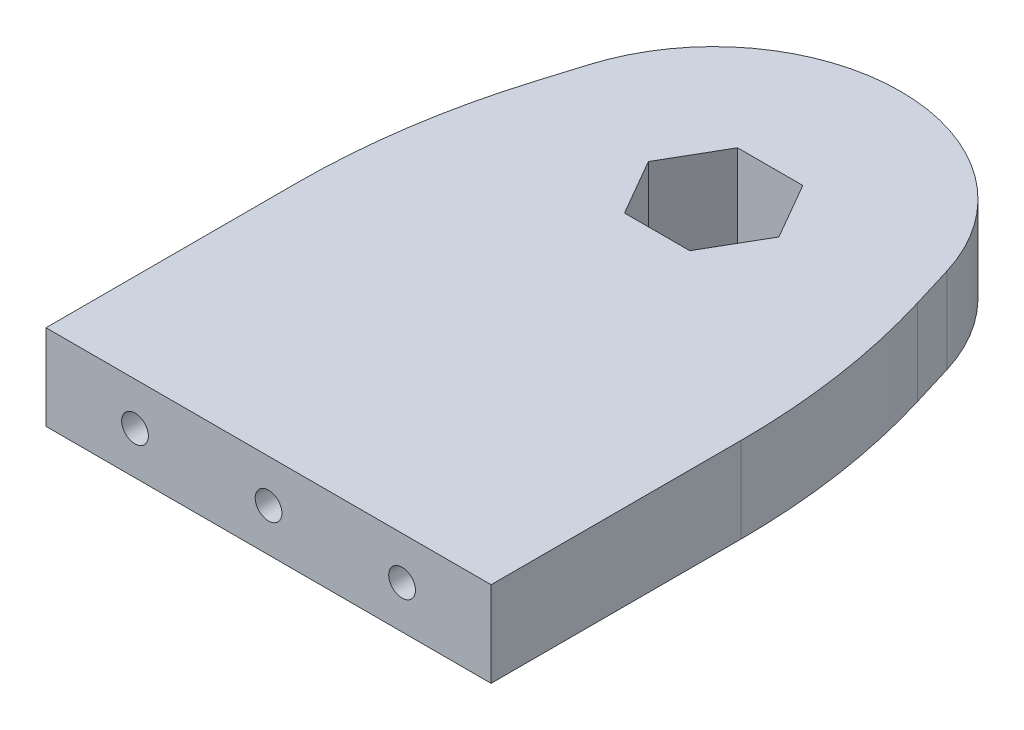
ISO-10303-21;
HEADER;
FILE_DESCRIPTION(('STEP AP214'),'2;1');
FILE_NAME('part.step','',(''),(''),'','','');
FILE_SCHEMA(('AUTOMOTIVE_DESIGN { 1 0 10303 214 1 1 1 1 }'));
ENDSEC;
DATA;
#1=APPLICATION_CONTEXT('core data for automotive mechanical design processes');
#2=APPLICATION_PROTOCOL_DEFINITION('international standard','automotive_design',2000,#1);
#3=PRODUCT_CONTEXT('',#1,'mechanical');
#4=PRODUCT('Part','Part','',(#3));
#5=PRODUCT_RELATED_PRODUCT_CATEGORY('part','',(#4));
#6=PRODUCT_DEFINITION_FORMATION('','',#4);
#7=PRODUCT_DEFINITION_CONTEXT('part definition',#1,'design');
#8=PRODUCT_DEFINITION('design','',#6,#7);
#9=PRODUCT_DEFINITION_SHAPE('','',#8);
#10=(LENGTH_UNIT() NAMED_UNIT(*) SI_UNIT(.MILLI.,.METRE.));
#11=(NAMED_UNIT(*) PLANE_ANGLE_UNIT() SI_UNIT($,.RADIAN.));
#12=(NAMED_UNIT(*) SI_UNIT($,.STERADIAN.) SOLID_ANGLE_UNIT());
#13=UNCERTAINTY_MEASURE_WITH_UNIT(LENGTH_MEASURE(1.E-05),#10,'distance_accuracy_value','');
#14=(GEOMETRIC_REPRESENTATION_CONTEXT(3) GLOBAL_UNCERTAINTY_ASSIGNED_CONTEXT((#13)) GLOBAL_UNIT_ASSIGNED_CONTEXT((#10,
#11,#12)) REPRESENTATION_CONTEXT('',''));
#15=CARTESIAN_POINT('',(0.,0.,0.));
#16=DIRECTION('',(0.,0.,1.));
#17=DIRECTION('',(1.,0.,0.));
#18=AXIS2_PLACEMENT_3D('',#15,#16,#17);
#19=CARTESIAN_POINT('',(28.4523865510361,9.6,-8.66907425965164));
#20=DIRECTION('',(-0.956583442018658,0.,0.291458605046645));
#21=DIRECTION('',(0.291458605046645,0.,0.956583442018658));
#22=AXIS2_PLACEMENT_3D('',#19,#20,#21);
#23=PLANE('',#22);
#24=DIRECTION('',(-0.291458605046645,0.,-0.956583442018658));
#25=VECTOR('',#24,1.);
#26=CARTESIAN_POINT('',(28.4523865510361,9.6,-8.66907425965164));
#27=LINE('',#26,#25);
#28=CARTESIAN_POINT('',(21.5266753614927,9.6,-31.3996457144226));
#29=VERTEX_POINT('',#28);
#30=CARTESIAN_POINT('',(20.0882522823918,9.6,-36.1206307059796));
#31=VERTEX_POINT('',#30);
#32=EDGE_CURVE('E202',#29,#31,#27,.T.);
#33=ORIENTED_EDGE('',*,*,#32,.F.);
#34=DIRECTION('',(0.,-1.,0.));
#35=VECTOR('',#34,1.);
#36=CARTESIAN_POINT('',(21.5266753614927,0.,-31.3996457144226));
#37=LINE('',#36,#35);
#38=CARTESIAN_POINT('',(21.5266753614927,0.,-31.3996457144226));
#39=VERTEX_POINT('',#38);
#40=EDGE_CURVE('E241',#29,#39,#37,.T.);
#41=ORIENTED_EDGE('',*,*,#40,.T.);
#42=DIRECTION('',(-0.291458605046645,0.,-0.956583442018658));
#43=VECTOR('',#42,1.);
#44=CARTESIAN_POINT('',(28.4523865510361,0.,-8.66907425965164));
#45=LINE('',#44,#43);
#46=CARTESIAN_POINT('',(20.0882522823918,0.,-36.1206307059796));
#47=VERTEX_POINT('',#46);
#48=EDGE_CURVE('E199',#39,#47,#45,.T.);
#49=ORIENTED_EDGE('',*,*,#48,.T.);
#50=DIRECTION('',(0.,-1.,0.));
#51=VECTOR('',#50,1.);
#52=CARTESIAN_POINT('',(20.0882522823918,9.6,-36.1206307059796));
#53=LINE('',#52,#51);
#54=EDGE_CURVE('E238',#31,#47,#53,.T.);
#55=ORIENTED_EDGE('',*,*,#54,.F.);
#56=EDGE_LOOP('',(#33,#41,#49,#55));
#57=FACE_BOUND('',#56,.T.);
#58=ADVANCED_FACE('F43',(#57),#23,.F.);
#59=CARTESIAN_POINT('',(0.,9.6,-30.));
#60=DIRECTION('',(0.,-1.,0.));
#61=DIRECTION('',(0.,0.,-1.));
#62=AXIS2_PLACEMENT_3D('',#59,#60,#61);
#63=CYLINDRICAL_SURFACE('',#62,21.);
#64=CARTESIAN_POINT('',(0.,0.,-30.));
#65=DIRECTION('',(0.,1.,0.));
#66=DIRECTION('',(0.,0.,1.));
#67=AXIS2_PLACEMENT_3D('',#64,#65,#66);
#68=CIRCLE('',#67,21.);
#69=CARTESIAN_POINT('',(-20.0882522823918,0.,-36.1206307059796));
#70=VERTEX_POINT('',#69);
#71=EDGE_CURVE('E219',#47,#70,#68,.T.);
#72=ORIENTED_EDGE('',*,*,#71,.T.);
#73=DIRECTION('',(0.,-1.,0.));
#74=VECTOR('',#73,1.);
#75=CARTESIAN_POINT('',(-20.0882522823918,9.6,-36.1206307059796));
#76=LINE('',#75,#74);
#77=CARTESIAN_POINT('',(-20.0882522823918,9.6,-36.1206307059796));
#78=VERTEX_POINT('',#77);
#79=EDGE_CURVE('E235',#78,#70,#76,.T.);
#80=ORIENTED_EDGE('',*,*,#79,.F.);
#81=CARTESIAN_POINT('',(0.,9.6,-30.));
#82=DIRECTION('',(0.,1.,0.));
#83=DIRECTION('',(0.,0.,1.));
#84=AXIS2_PLACEMENT_3D('',#81,#82,#83);
#85=CIRCLE('',#84,21.);
#86=EDGE_CURVE('E204',#31,#78,#85,.T.);
#87=ORIENTED_EDGE('',*,*,#86,.F.);
#88=ORIENTED_EDGE('',*,*,#54,.T.);
#89=EDGE_LOOP('',(#72,#80,#87,#88));
#90=FACE_BOUND('',#89,.T.);
#91=ADVANCED_FACE('F295',(#90),#63,.T.);
#92=CARTESIAN_POINT('',(-28.4523865510361,9.6,-8.66907425965166));
#93=DIRECTION('',(-0.956583442018658,0.,-0.291458605046646));
#94=DIRECTION('',(-0.291458605046646,0.,0.956583442018658));
#95=AXIS2_PLACEMENT_3D('',#92,#93,#94);
#96=PLANE('',#95);
#97=DIRECTION('',(0.291458605046646,0.,-0.956583442018658));
#98=VECTOR('',#97,1.);
#99=CARTESIAN_POINT('',(-28.4523865510361,0.,-8.66907425965166));
#100=LINE('',#99,#98);
#101=CARTESIAN_POINT('',(-21.5266753614926,0.,-31.3996457144226));
#102=VERTEX_POINT('',#101);
#103=EDGE_CURVE('E222',#102,#70,#100,.T.);
#104=ORIENTED_EDGE('',*,*,#103,.F.);
#105=DIRECTION('',(0.,-1.,0.));
#106=VECTOR('',#105,1.);
#107=CARTESIAN_POINT('',(-21.5266753614926,9.6,-31.3996457144226));
#108=LINE('',#107,#106);
#109=CARTESIAN_POINT('',(-21.5266753614926,9.6,-31.3996457144226));
#110=VERTEX_POINT('',#109);
#111=EDGE_CURVE('E257',#102,#110,#108,.F.);
#112=ORIENTED_EDGE('',*,*,#111,.T.);
#113=DIRECTION('',(0.291458605046646,0.,-0.956583442018658));
#114=VECTOR('',#113,1.);
#115=CARTESIAN_POINT('',(-28.4523865510361,9.6,-8.66907425965166));
#116=LINE('',#115,#114);
#117=EDGE_CURVE('E208',#110,#78,#116,.T.);
#118=ORIENTED_EDGE('',*,*,#117,.T.);
#119=ORIENTED_EDGE('',*,*,#79,.T.);
#120=EDGE_LOOP('',(#104,#112,#118,#119));
#121=FACE_BOUND('',#120,.T.);
#122=ADVANCED_FACE('F301',(#121),#96,.T.);
#123=CARTESIAN_POINT('',(-25.,9.6,0.));
#124=DIRECTION('',(1.,0.,0.));
#125=DIRECTION('',(0.,0.,-1.));
#126=AXIS2_PLACEMENT_3D('',#123,#124,#125);
#127=PLANE('',#126);
#128=DIRECTION('',(0.,0.,1.));
#129=VECTOR('',#128,1.);
#130=CARTESIAN_POINT('',(-25.,9.6,0.));
#131=LINE('',#130,#129);
#132=CARTESIAN_POINT('',(-25.,9.6,-8.08295731069094));
#133=VERTEX_POINT('',#132);
#134=CARTESIAN_POINT('',(-25.,9.6,20.));
#135=VERTEX_POINT('',#134);
#136=EDGE_CURVE('E210',#133,#135,#131,.T.);
#137=ORIENTED_EDGE('',*,*,#136,.F.);
#138=DIRECTION('',(0.,-1.,0.));
#139=VECTOR('',#138,1.);
#140=CARTESIAN_POINT('',(-25.,0.,-8.08295731069094));
#141=LINE('',#140,#139);
#142=CARTESIAN_POINT('',(-25.,0.,-8.08295731069094));
#143=VERTEX_POINT('',#142);
#144=EDGE_CURVE('E254',#133,#143,#141,.T.);
#145=ORIENTED_EDGE('',*,*,#144,.T.);
#146=DIRECTION('',(0.,0.,1.));
#147=VECTOR('',#146,1.);
#148=CARTESIAN_POINT('',(-25.,0.,0.));
#149=LINE('',#148,#147);
#150=CARTESIAN_POINT('',(-25.,0.,20.));
#151=VERTEX_POINT('',#150);
#152=EDGE_CURVE('E224',#143,#151,#149,.T.);
#153=ORIENTED_EDGE('',*,*,#152,.T.);
#154=DIRECTION('',(0.,-1.,0.));
#155=VECTOR('',#154,1.);
#156=CARTESIAN_POINT('',(-25.,9.6,20.));
#157=LINE('',#156,#155);
#158=EDGE_CURVE('E232',#135,#151,#157,.T.);
#159=ORIENTED_EDGE('',*,*,#158,.F.);
#160=EDGE_LOOP('',(#137,#145,#153,#159));
#161=FACE_BOUND('',#160,.T.);
#162=ADVANCED_FACE('F333',(#161),#127,.F.);
#163=CARTESIAN_POINT('',(0.,9.6,20.));
#164=DIRECTION('',(0.,0.,-1.));
#165=DIRECTION('',(-1.,0.,0.));
#166=AXIS2_PLACEMENT_3D('',#163,#164,#165);
#167=PLANE('',#166);
#168=CARTESIAN_POINT('',(15.,4.8,20.));
#169=DIRECTION('',(0.,0.,1.));
#170=DIRECTION('',(1.,0.,0.));
#171=AXIS2_PLACEMENT_3D('',#168,#169,#170);
#172=CIRCLE('',#171,1.5);
#173=CARTESIAN_POINT('',(16.5,4.8,20.));
#174=VERTEX_POINT('',#173);
#175=EDGE_CURVE('E184',#174,#174,#172,.T.);
#176=ORIENTED_EDGE('',*,*,#175,.F.);
#177=EDGE_LOOP('',(#176));
#178=FACE_BOUND('',#177,.T.);
#179=CARTESIAN_POINT('',(-15.,4.8,20.));
#180=DIRECTION('',(0.,0.,1.));
#181=DIRECTION('',(1.,0.,0.));
#182=AXIS2_PLACEMENT_3D('',#179,#180,#181);
#183=CIRCLE('',#182,1.5);
#184=CARTESIAN_POINT('',(-13.5,4.8,20.));
#185=VERTEX_POINT('',#184);
#186=EDGE_CURVE('E177',#185,#185,#183,.T.);
#187=ORIENTED_EDGE('',*,*,#186,.F.);
#188=EDGE_LOOP('',(#187));
#189=FACE_BOUND('',#188,.T.);
#190=CARTESIAN_POINT('',(0.,4.8,20.));
#191=DIRECTION('',(0.,0.,1.));
#192=DIRECTION('',(1.,0.,0.));
#193=AXIS2_PLACEMENT_3D('',#190,#191,#192);
#194=CIRCLE('',#193,1.5);
#195=CARTESIAN_POINT('',(1.5,4.8,20.));
#196=VERTEX_POINT('',#195);
#197=EDGE_CURVE('E191',#196,#196,#194,.T.);
#198=ORIENTED_EDGE('',*,*,#197,.F.);
#199=EDGE_LOOP('',(#198));
#200=FACE_BOUND('',#199,.T.);
#201=DIRECTION('',(1.,0.,0.));
#202=VECTOR('',#201,1.);
#203=CARTESIAN_POINT('',(0.,0.,20.));
#204=LINE('',#203,#202);
#205=CARTESIAN_POINT('',(25.,0.,20.));
#206=VERTEX_POINT('',#205);
#207=EDGE_CURVE('E226',#151,#206,#204,.T.);
#208=ORIENTED_EDGE('',*,*,#207,.T.);
#209=DIRECTION('',(0.,-1.,0.));
#210=VECTOR('',#209,1.);
#211=CARTESIAN_POINT('',(25.,9.6,20.));
#212=LINE('',#211,#210);
#213=CARTESIAN_POINT('',(25.,9.6,20.));
#214=VERTEX_POINT('',#213);
#215=EDGE_CURVE('E217',#214,#206,#212,.T.);
#216=ORIENTED_EDGE('',*,*,#215,.F.);
#217=DIRECTION('',(1.,0.,0.));
#218=VECTOR('',#217,1.);
#219=CARTESIAN_POINT('',(0.,9.6,20.));
#220=LINE('',#219,#218);
#221=EDGE_CURVE('E212',#135,#214,#220,.T.);
#222=ORIENTED_EDGE('',*,*,#221,.F.);
#223=ORIENTED_EDGE('',*,*,#158,.T.);
#224=EDGE_LOOP('',(#208,#216,#222,#223));
#225=FACE_BOUND('',#224,.T.);
#226=ADVANCED_FACE('F340',(#178,#189,#200,#225),#167,.F.);
#227=CARTESIAN_POINT('',(25.,9.6,0.));
#228=DIRECTION('',(1.,0.,0.));
#229=DIRECTION('',(0.,0.,-1.));
#230=AXIS2_PLACEMENT_3D('',#227,#228,#229);
#231=PLANE('',#230);
#232=DIRECTION('',(0.,0.,1.));
#233=VECTOR('',#232,1.);
#234=CARTESIAN_POINT('',(25.,0.,0.));
#235=LINE('',#234,#233);
#236=CARTESIAN_POINT('',(25.,0.,-8.08295731069096));
#237=VERTEX_POINT('',#236);
#238=EDGE_CURVE('E205',#237,#206,#235,.T.);
#239=ORIENTED_EDGE('',*,*,#238,.F.);
#240=DIRECTION('',(0.,-1.,0.));
#241=VECTOR('',#240,1.);
#242=CARTESIAN_POINT('',(25.,9.6,-8.08295731069096));
#243=LINE('',#242,#241);
#244=CARTESIAN_POINT('',(25.,9.6,-8.08295731069096));
#245=VERTEX_POINT('',#244);
#246=EDGE_CURVE('E248',#237,#245,#243,.F.);
#247=ORIENTED_EDGE('',*,*,#246,.T.);
#248=DIRECTION('',(0.,0.,1.));
#249=VECTOR('',#248,1.);
#250=CARTESIAN_POINT('',(25.,9.6,0.));
#251=LINE('',#250,#249);
#252=EDGE_CURVE('E215',#245,#214,#251,.T.);
#253=ORIENTED_EDGE('',*,*,#252,.T.);
#254=ORIENTED_EDGE('',*,*,#215,.T.);
#255=EDGE_LOOP('',(#239,#247,#253,#254));
#256=FACE_BOUND('',#255,.T.);
#257=ADVANCED_FACE('F343',(#256),#231,.T.);
#258=CARTESIAN_POINT('',(0.,9.6,0.));
#259=DIRECTION('',(0.,1.,0.));
#260=DIRECTION('',(0.,0.,1.));
#261=AXIS2_PLACEMENT_3D('',#258,#259,#260);
#262=PLANE('',#261);
#263=DIRECTION('',(-0.5,0.,-0.866025403784439));
#264=VECTOR('',#263,1.);
#265=CARTESIAN_POINT('',(7.33234841870825,9.6,-30.));
#266=LINE('',#265,#264);
#267=CARTESIAN_POINT('',(7.33234841870825,9.6,-30.));
#268=VERTEX_POINT('',#267);
#269=CARTESIAN_POINT('',(3.66617420935413,9.6,-36.35));
#270=VERTEX_POINT('',#269);
#271=EDGE_CURVE('E58',#268,#270,#266,.T.);
#272=ORIENTED_EDGE('',*,*,#271,.F.);
#273=DIRECTION('',(0.5,0.,-0.866025403784439));
#274=VECTOR('',#273,1.);
#275=CARTESIAN_POINT('',(3.66617420935412,9.6,-23.65));
#276=LINE('',#275,#274);
#277=CARTESIAN_POINT('',(3.66617420935412,9.6,-23.65));
#278=VERTEX_POINT('',#277);
#279=EDGE_CURVE('E172',#278,#268,#276,.T.);
#280=ORIENTED_EDGE('',*,*,#279,.F.);
#281=DIRECTION('',(1.,0.,0.));
#282=VECTOR('',#281,1.);
#283=CARTESIAN_POINT('',(-3.66617420935413,9.6,-23.65));
#284=LINE('',#283,#282);
#285=CARTESIAN_POINT('',(-3.66617420935413,9.6,-23.65));
#286=VERTEX_POINT('',#285);
#287=EDGE_CURVE('E166',#286,#278,#284,.T.);
#288=ORIENTED_EDGE('',*,*,#287,.F.);
#289=DIRECTION('',(0.5,0.,0.866025403784439));
#290=VECTOR('',#289,1.);
#291=CARTESIAN_POINT('',(-7.33234841870825,9.6,-30.));
#292=LINE('',#291,#290);
#293=CARTESIAN_POINT('',(-7.33234841870825,9.6,-30.));
#294=VERTEX_POINT('',#293);
#295=EDGE_CURVE('E164',#294,#286,#292,.T.);
#296=ORIENTED_EDGE('',*,*,#295,.F.);
#297=DIRECTION('',(-0.5,0.,0.866025403784439));
#298=VECTOR('',#297,1.);
#299=CARTESIAN_POINT('',(-3.66617420935412,9.6,-36.35));
#300=LINE('',#299,#298);
#301=CARTESIAN_POINT('',(-3.66617420935412,9.6,-36.35));
#302=VERTEX_POINT('',#301);
#303=EDGE_CURVE('E147',#302,#294,#300,.T.);
#304=ORIENTED_EDGE('',*,*,#303,.F.);
#305=DIRECTION('',(-1.,0.,0.));
#306=VECTOR('',#305,1.);
#307=CARTESIAN_POINT('',(3.66617420935413,9.6,-36.35));
#308=LINE('',#307,#306);
#309=EDGE_CURVE('E156',#270,#302,#308,.T.);
#310=ORIENTED_EDGE('',*,*,#309,.F.);
#311=EDGE_LOOP('',(#272,#280,#288,#296,#304,#310));
#312=FACE_BOUND('',#311,.T.);
#313=ORIENTED_EDGE('',*,*,#252,.F.);
#314=CARTESIAN_POINT('',(-55.,9.6,-8.08295731069094));
#315=DIRECTION('',(0.,1.,0.));
#316=DIRECTION('',(0.,0.,1.));
#317=AXIS2_PLACEMENT_3D('',#314,#315,#316);
#318=CIRCLE('',#317,80.);
#319=EDGE_CURVE('E252',#245,#29,#318,.T.);
#320=ORIENTED_EDGE('',*,*,#319,.T.);
#321=ORIENTED_EDGE('',*,*,#32,.T.);
#322=ORIENTED_EDGE('',*,*,#86,.T.);
#323=ORIENTED_EDGE('',*,*,#117,.F.);
#324=CARTESIAN_POINT('',(55.,9.6,-8.08295731069095));
#325=DIRECTION('',(0.,1.,0.));
#326=DIRECTION('',(0.,0.,1.));
#327=AXIS2_PLACEMENT_3D('',#324,#325,#326);
#328=CIRCLE('',#327,80.);
#329=EDGE_CURVE('E250',#110,#133,#328,.T.);
#330=ORIENTED_EDGE('',*,*,#329,.T.);
#331=ORIENTED_EDGE('',*,*,#136,.T.);
#332=ORIENTED_EDGE('',*,*,#221,.T.);
#333=EDGE_LOOP('',(#313,#320,#321,#322,#323,#330,#331,#332));
#334=FACE_BOUND('',#333,.T.);
#335=ADVANCED_FACE('F160',(#312,#334),#262,.T.);
#336=CARTESIAN_POINT('',(0.,0.,0.));
#337=DIRECTION('',(0.,1.,0.));
#338=DIRECTION('',(0.,0.,1.));
#339=AXIS2_PLACEMENT_3D('',#336,#337,#338);
#340=PLANE('',#339);
#341=DIRECTION('',(0.5,0.,-0.866025403784439));
#342=VECTOR('',#341,1.);
#343=CARTESIAN_POINT('',(-7.4911197427354,0.,-4.325));
#344=LINE('',#343,#342);
#345=CARTESIAN_POINT('',(3.66617420935412,0.,-23.65));
#346=VERTEX_POINT('',#345);
#347=CARTESIAN_POINT('',(7.33234841870825,0.,-30.));
#348=VERTEX_POINT('',#347);
#349=EDGE_CURVE('E51',#346,#348,#344,.T.);
#350=ORIENTED_EDGE('',*,*,#349,.T.);
#351=DIRECTION('',(-0.5,0.,-0.866025403784439));
#352=VECTOR('',#351,1.);
#353=CARTESIAN_POINT('',(18.4896423707978,0.,-10.675));
#354=LINE('',#353,#352);
#355=CARTESIAN_POINT('',(3.66617420935413,0.,-36.35));
#356=VERTEX_POINT('',#355);
#357=EDGE_CURVE('E11',#348,#356,#354,.T.);
#358=ORIENTED_EDGE('',*,*,#357,.T.);
#359=DIRECTION('',(-1.,0.,0.));
#360=VECTOR('',#359,1.);
#361=CARTESIAN_POINT('',(0.,0.,-36.35));
#362=LINE('',#361,#360);
#363=CARTESIAN_POINT('',(-3.66617420935412,0.,-36.35));
#364=VERTEX_POINT('',#363);
#365=EDGE_CURVE('E259',#356,#364,#362,.T.);
#366=ORIENTED_EDGE('',*,*,#365,.T.);
#367=DIRECTION('',(-0.5,0.,0.866025403784439));
#368=VECTOR('',#367,1.);
#369=CARTESIAN_POINT('',(-18.4896423707978,0.,-10.675));
#370=LINE('',#369,#368);
#371=CARTESIAN_POINT('',(-7.33234841870825,0.,-30.));
#372=VERTEX_POINT('',#371);
#373=EDGE_CURVE('E150',#364,#372,#370,.T.);
#374=ORIENTED_EDGE('',*,*,#373,.T.);
#375=DIRECTION('',(0.5,0.,0.866025403784439));
#376=VECTOR('',#375,1.);
#377=CARTESIAN_POINT('',(7.49111974273539,0.,-4.325));
#378=LINE('',#377,#376);
#379=CARTESIAN_POINT('',(-3.66617420935413,0.,-23.65));
#380=VERTEX_POINT('',#379);
#381=EDGE_CURVE('E262',#372,#380,#378,.T.);
#382=ORIENTED_EDGE('',*,*,#381,.T.);
#383=DIRECTION('',(1.,0.,0.));
#384=VECTOR('',#383,1.);
#385=CARTESIAN_POINT('',(0.,0.,-23.65));
#386=LINE('',#385,#384);
#387=EDGE_CURVE('E265',#380,#346,#386,.T.);
#388=ORIENTED_EDGE('',*,*,#387,.T.);
#389=EDGE_LOOP('',(#350,#358,#366,#374,#382,#388));
#390=FACE_BOUND('',#389,.T.);
#391=ORIENTED_EDGE('',*,*,#48,.F.);
#392=CARTESIAN_POINT('',(-55.,0.,-8.08295731069094));
#393=DIRECTION('',(0.,1.,0.));
#394=DIRECTION('',(0.,0.,1.));
#395=AXIS2_PLACEMENT_3D('',#392,#393,#394);
#396=CIRCLE('',#395,80.);
#397=EDGE_CURVE('E246',#39,#237,#396,.F.);
#398=ORIENTED_EDGE('',*,*,#397,.T.);
#399=ORIENTED_EDGE('',*,*,#238,.T.);
#400=ORIENTED_EDGE('',*,*,#207,.F.);
#401=ORIENTED_EDGE('',*,*,#152,.F.);
#402=CARTESIAN_POINT('',(55.,0.,-8.08295731069095));
#403=DIRECTION('',(0.,1.,0.));
#404=DIRECTION('',(0.,0.,1.));
#405=AXIS2_PLACEMENT_3D('',#402,#403,#404);
#406=CIRCLE('',#405,80.);
#407=EDGE_CURVE('E244',#143,#102,#406,.F.);
#408=ORIENTED_EDGE('',*,*,#407,.T.);
#409=ORIENTED_EDGE('',*,*,#103,.T.);
#410=ORIENTED_EDGE('',*,*,#71,.F.);
#411=EDGE_LOOP('',(#391,#398,#399,#400,#401,#408,#409,#410));
#412=FACE_BOUND('',#411,.T.);
#413=ADVANCED_FACE('F269',(#390,#412),#340,.F.);
#414=CARTESIAN_POINT('',(-55.,9.6,-8.08295731069094));
#415=DIRECTION('',(0.,1.,0.));
#416=DIRECTION('',(0.,0.,1.));
#417=AXIS2_PLACEMENT_3D('',#414,#415,#416);
#418=CYLINDRICAL_SURFACE('',#417,80.);
#419=ORIENTED_EDGE('',*,*,#319,.F.);
#420=ORIENTED_EDGE('',*,*,#246,.F.);
#421=ORIENTED_EDGE('',*,*,#397,.F.);
#422=ORIENTED_EDGE('',*,*,#40,.F.);
#423=EDGE_LOOP('',(#419,#420,#421,#422));
#424=FACE_BOUND('',#423,.T.);
#425=ADVANCED_FACE('F306',(#424),#418,.T.);
#426=CARTESIAN_POINT('',(55.,9.6,-8.08295731069095));
#427=DIRECTION('',(0.,1.,0.));
#428=DIRECTION('',(0.,0.,1.));
#429=AXIS2_PLACEMENT_3D('',#426,#427,#428);
#430=CYLINDRICAL_SURFACE('',#429,80.);
#431=ORIENTED_EDGE('',*,*,#329,.F.);
#432=ORIENTED_EDGE('',*,*,#111,.F.);
#433=ORIENTED_EDGE('',*,*,#407,.F.);
#434=ORIENTED_EDGE('',*,*,#144,.F.);
#435=EDGE_LOOP('',(#431,#432,#433,#434));
#436=FACE_BOUND('',#435,.T.);
#437=ADVANCED_FACE('F45',(#436),#430,.T.);
#438=CARTESIAN_POINT('',(0.,4.8,5.));
#439=DIRECTION('',(0.,0.,1.));
#440=DIRECTION('',(1.,0.,0.));
#441=AXIS2_PLACEMENT_3D('',#438,#439,#440);
#442=CYLINDRICAL_SURFACE('',#441,1.5);
#443=CARTESIAN_POINT('',(0.,4.8,5.));
#444=DIRECTION('',(0.,0.,1.));
#445=DIRECTION('',(1.,0.,0.));
#446=AXIS2_PLACEMENT_3D('',#443,#444,#445);
#447=CIRCLE('',#446,1.5);
#448=CARTESIAN_POINT('',(1.5,4.8,5.));
#449=VERTEX_POINT('',#448);
#450=EDGE_CURVE('E196',#449,#449,#447,.T.);
#451=ORIENTED_EDGE('',*,*,#450,.F.);
#452=EDGE_LOOP('',(#451));
#453=FACE_BOUND('',#452,.T.);
#454=ORIENTED_EDGE('',*,*,#197,.T.);
#455=EDGE_LOOP('',(#454));
#456=FACE_BOUND('',#455,.T.);
#457=ADVANCED_FACE('F313',(#453,#456),#442,.F.);
#458=CARTESIAN_POINT('',(0.,4.8,5.));
#459=DIRECTION('',(0.,0.,1.));
#460=DIRECTION('',(1.,0.,0.));
#461=AXIS2_PLACEMENT_3D('',#458,#459,#460);
#462=PLANE('',#461);
#463=ORIENTED_EDGE('',*,*,#450,.T.);
#464=EDGE_LOOP('',(#463));
#465=FACE_BOUND('',#464,.T.);
#466=ADVANCED_FACE('F376',(#465),#462,.T.);
#467=CARTESIAN_POINT('',(-15.,4.8,5.));
#468=DIRECTION('',(0.,0.,1.));
#469=DIRECTION('',(1.,0.,0.));
#470=AXIS2_PLACEMENT_3D('',#467,#468,#469);
#471=CYLINDRICAL_SURFACE('',#470,1.5);
#472=CARTESIAN_POINT('',(-15.,4.8,5.));
#473=DIRECTION('',(0.,0.,1.));
#474=DIRECTION('',(1.,0.,0.));
#475=AXIS2_PLACEMENT_3D('',#472,#473,#474);
#476=CIRCLE('',#475,1.5);
#477=CARTESIAN_POINT('',(-13.5,4.8,5.));
#478=VERTEX_POINT('',#477);
#479=EDGE_CURVE('E188',#478,#478,#476,.T.);
#480=ORIENTED_EDGE('',*,*,#479,.F.);
#481=EDGE_LOOP('',(#480));
#482=FACE_BOUND('',#481,.T.);
#483=ORIENTED_EDGE('',*,*,#186,.T.);
#484=EDGE_LOOP('',(#483));
#485=FACE_BOUND('',#484,.T.);
#486=ADVANCED_FACE('F381',(#482,#485),#471,.F.);
#487=CARTESIAN_POINT('',(-15.,4.8,5.));
#488=DIRECTION('',(0.,0.,1.));
#489=DIRECTION('',(1.,0.,0.));
#490=AXIS2_PLACEMENT_3D('',#487,#488,#489);
#491=PLANE('',#490);
#492=ORIENTED_EDGE('',*,*,#479,.T.);
#493=EDGE_LOOP('',(#492));
#494=FACE_BOUND('',#493,.T.);
#495=ADVANCED_FACE('F386',(#494),#491,.T.);
#496=CARTESIAN_POINT('',(15.,4.8,5.));
#497=DIRECTION('',(0.,0.,1.));
#498=DIRECTION('',(1.,0.,0.));
#499=AXIS2_PLACEMENT_3D('',#496,#497,#498);
#500=CYLINDRICAL_SURFACE('',#499,1.5);
#501=CARTESIAN_POINT('',(15.,4.8,5.));
#502=DIRECTION('',(0.,0.,1.));
#503=DIRECTION('',(1.,0.,0.));
#504=AXIS2_PLACEMENT_3D('',#501,#502,#503);
#505=CIRCLE('',#504,1.5);
#506=CARTESIAN_POINT('',(16.5,4.8,5.));
#507=VERTEX_POINT('',#506);
#508=EDGE_CURVE('E187',#507,#507,#505,.T.);
#509=ORIENTED_EDGE('',*,*,#508,.F.);
#510=EDGE_LOOP('',(#509));
#511=FACE_BOUND('',#510,.T.);
#512=ORIENTED_EDGE('',*,*,#175,.T.);
#513=EDGE_LOOP('',(#512));
#514=FACE_BOUND('',#513,.T.);
#515=ADVANCED_FACE('F290',(#511,#514),#500,.F.);
#516=CARTESIAN_POINT('',(15.,4.8,5.));
#517=DIRECTION('',(0.,0.,1.));
#518=DIRECTION('',(1.,0.,0.));
#519=AXIS2_PLACEMENT_3D('',#516,#517,#518);
#520=PLANE('',#519);
#521=ORIENTED_EDGE('',*,*,#508,.T.);
#522=EDGE_LOOP('',(#521));
#523=FACE_BOUND('',#522,.T.);
#524=ADVANCED_FACE('F283',(#523),#520,.T.);
#525=CARTESIAN_POINT('',(7.33234841870825,-0.400000000000001,-30.));
#526=DIRECTION('',(0.866025403784439,0.,-0.5));
#527=DIRECTION('',(-0.5,0.,-0.866025403784439));
#528=AXIS2_PLACEMENT_3D('',#525,#526,#527);
#529=PLANE('',#528);
#530=DIRECTION('',(0.,1.,0.));
#531=VECTOR('',#530,1.);
#532=CARTESIAN_POINT('',(7.33234841870825,-0.400000000000001,-30.));
#533=LINE('',#532,#531);
#534=EDGE_CURVE('E175',#348,#268,#533,.T.);
#535=ORIENTED_EDGE('',*,*,#534,.T.);
#536=ORIENTED_EDGE('',*,*,#271,.T.);
#537=DIRECTION('',(0.,1.,0.));
#538=VECTOR('',#537,1.);
#539=CARTESIAN_POINT('',(3.66617420935413,-0.400000000000001,-36.35));
#540=LINE('',#539,#538);
#541=EDGE_CURVE('E153',#356,#270,#540,.T.);
#542=ORIENTED_EDGE('',*,*,#541,.F.);
#543=ORIENTED_EDGE('',*,*,#357,.F.);
#544=EDGE_LOOP('',(#535,#536,#542,#543));
#545=FACE_BOUND('',#544,.T.);
#546=ADVANCED_FACE('F281',(#545),#529,.F.);
#547=CARTESIAN_POINT('',(3.66617420935412,-0.400000000000001,-23.65));
#548=DIRECTION('',(0.866025403784439,0.,0.5));
#549=DIRECTION('',(0.5,0.,-0.866025403784439));
#550=AXIS2_PLACEMENT_3D('',#547,#548,#549);
#551=PLANE('',#550);
#552=DIRECTION('',(0.,1.,0.));
#553=VECTOR('',#552,1.);
#554=CARTESIAN_POINT('',(3.66617420935412,-0.400000000000001,-23.65));
#555=LINE('',#554,#553);
#556=EDGE_CURVE('E178',#346,#278,#555,.T.);
#557=ORIENTED_EDGE('',*,*,#556,.T.);
#558=ORIENTED_EDGE('',*,*,#279,.T.);
#559=ORIENTED_EDGE('',*,*,#534,.F.);
#560=ORIENTED_EDGE('',*,*,#349,.F.);
#561=EDGE_LOOP('',(#557,#558,#559,#560));
#562=FACE_BOUND('',#561,.T.);
#563=ADVANCED_FACE('F274',(#562),#551,.F.);
#564=CARTESIAN_POINT('',(-3.66617420935413,-0.400000000000001,-23.65));
#565=DIRECTION('',(0.,0.,1.));
#566=DIRECTION('',(1.,0.,0.));
#567=AXIS2_PLACEMENT_3D('',#564,#565,#566);
#568=PLANE('',#567);
#569=DIRECTION('',(0.,1.,0.));
#570=VECTOR('',#569,1.);
#571=CARTESIAN_POINT('',(-3.66617420935413,-0.400000000000001,-23.65));
#572=LINE('',#571,#570);
#573=EDGE_CURVE('E180',#380,#286,#572,.T.);
#574=ORIENTED_EDGE('',*,*,#573,.T.);
#575=ORIENTED_EDGE('',*,*,#287,.T.);
#576=ORIENTED_EDGE('',*,*,#556,.F.);
#577=ORIENTED_EDGE('',*,*,#387,.F.);
#578=EDGE_LOOP('',(#574,#575,#576,#577));
#579=FACE_BOUND('',#578,.T.);
#580=ADVANCED_FACE('F276',(#579),#568,.F.);
#581=CARTESIAN_POINT('',(-7.33234841870825,-0.400000000000001,-30.));
#582=DIRECTION('',(-0.866025403784439,0.,0.5));
#583=DIRECTION('',(0.5,0.,0.866025403784439));
#584=AXIS2_PLACEMENT_3D('',#581,#582,#583);
#585=PLANE('',#584);
#586=DIRECTION('',(0.,1.,0.));
#587=VECTOR('',#586,1.);
#588=CARTESIAN_POINT('',(-7.33234841870825,-0.400000000000001,-30.));
#589=LINE('',#588,#587);
#590=EDGE_CURVE('E152',#372,#294,#589,.T.);
#591=ORIENTED_EDGE('',*,*,#590,.T.);
#592=ORIENTED_EDGE('',*,*,#295,.T.);
#593=ORIENTED_EDGE('',*,*,#573,.F.);
#594=ORIENTED_EDGE('',*,*,#381,.F.);
#595=EDGE_LOOP('',(#591,#592,#593,#594));
#596=FACE_BOUND('',#595,.T.);
#597=ADVANCED_FACE('F280',(#596),#585,.F.);
#598=CARTESIAN_POINT('',(-3.66617420935412,-0.400000000000001,-36.35));
#599=DIRECTION('',(-0.866025403784439,0.,-0.5));
#600=DIRECTION('',(-0.5,0.,0.866025403784439));
#601=AXIS2_PLACEMENT_3D('',#598,#599,#600);
#602=PLANE('',#601);
#603=DIRECTION('',(0.,1.,0.));
#604=VECTOR('',#603,1.);
#605=CARTESIAN_POINT('',(-3.66617420935412,-0.400000000000001,-36.35));
#606=LINE('',#605,#604);
#607=EDGE_CURVE('E66',#364,#302,#606,.T.);
#608=ORIENTED_EDGE('',*,*,#607,.T.);
#609=ORIENTED_EDGE('',*,*,#303,.T.);
#610=ORIENTED_EDGE('',*,*,#590,.F.);
#611=ORIENTED_EDGE('',*,*,#373,.F.);
#612=EDGE_LOOP('',(#608,#609,#610,#611));
#613=FACE_BOUND('',#612,.T.);
#614=ADVANCED_FACE('F144',(#613),#602,.F.);
#615=CARTESIAN_POINT('',(3.66617420935413,-0.400000000000001,-36.35));
#616=DIRECTION('',(0.,0.,-1.));
#617=DIRECTION('',(-1.,0.,0.));
#618=AXIS2_PLACEMENT_3D('',#615,#616,#617);
#619=PLANE('',#618);
#620=ORIENTED_EDGE('',*,*,#541,.T.);
#621=ORIENTED_EDGE('',*,*,#309,.T.);
#622=ORIENTED_EDGE('',*,*,#607,.F.);
#623=ORIENTED_EDGE('',*,*,#365,.F.);
#624=EDGE_LOOP('',(#620,#621,#622,#623));
#625=FACE_BOUND('',#624,.T.);
#626=ADVANCED_FACE('F157',(#625),#619,.F.);
#627=CLOSED_SHELL('',(#58,#91,#122,#162,#226,#257,#335,#413,#425,#437,#457,#466,#486,#495,#515,
#524,#546,#563,#580,#597,#614,#626));
#628=MANIFOLD_SOLID_BREP('B2',#627);
#629=ADVANCED_BREP_SHAPE_REPRESENTATION('',(#18,#628),#14);
#630=SHAPE_DEFINITION_REPRESENTATION(#9,#629);
ENDSEC;
END-ISO-10303-21;
